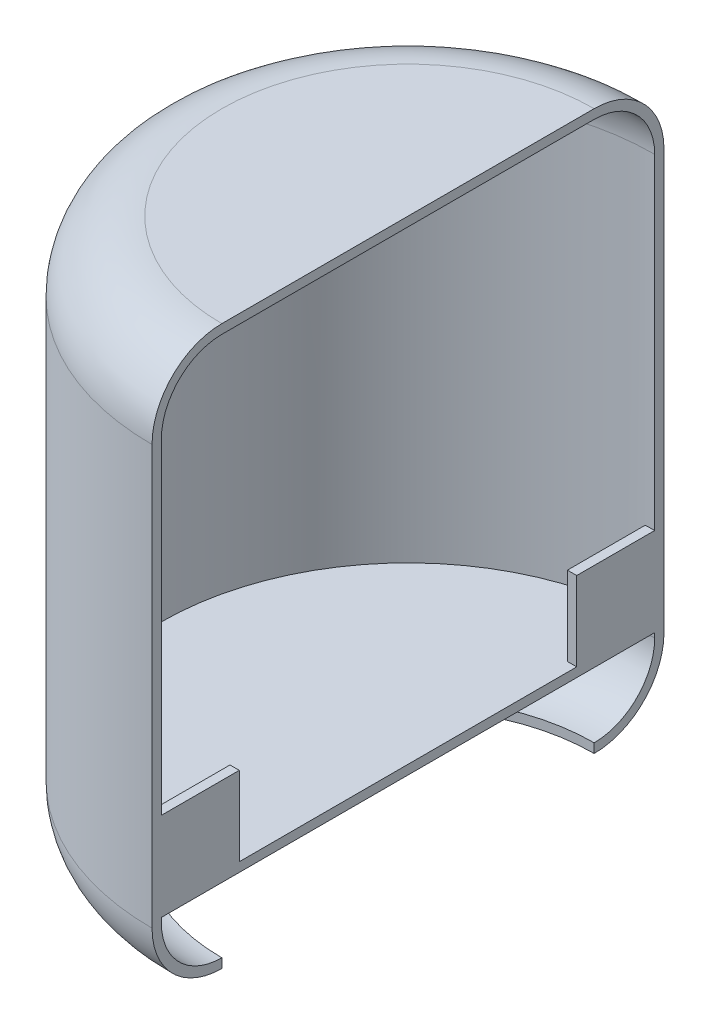
ISO-10303-21;
HEADER;
FILE_DESCRIPTION(('STEP AP214'),'2;1');
FILE_NAME('part.step','',(''),(''),'','','');
FILE_SCHEMA(('AUTOMOTIVE_DESIGN { 1 0 10303 214 1 1 1 1 }'));
ENDSEC;
DATA;
#1=APPLICATION_CONTEXT('core data for automotive mechanical design processes');
#2=APPLICATION_PROTOCOL_DEFINITION('international standard','automotive_design',2000,#1);
#3=PRODUCT_CONTEXT('',#1,'mechanical');
#4=PRODUCT('Part','Part','',(#3));
#5=PRODUCT_RELATED_PRODUCT_CATEGORY('part','',(#4));
#6=PRODUCT_DEFINITION_FORMATION('','',#4);
#7=PRODUCT_DEFINITION_CONTEXT('part definition',#1,'design');
#8=PRODUCT_DEFINITION('design','',#6,#7);
#9=PRODUCT_DEFINITION_SHAPE('','',#8);
#10=(LENGTH_UNIT() NAMED_UNIT(*) SI_UNIT(.MILLI.,.METRE.));
#11=(NAMED_UNIT(*) PLANE_ANGLE_UNIT() SI_UNIT($,.RADIAN.));
#12=(NAMED_UNIT(*) SI_UNIT($,.STERADIAN.) SOLID_ANGLE_UNIT());
#13=UNCERTAINTY_MEASURE_WITH_UNIT(LENGTH_MEASURE(1.E-05),#10,'distance_accuracy_value','');
#14=(GEOMETRIC_REPRESENTATION_CONTEXT(3) GLOBAL_UNCERTAINTY_ASSIGNED_CONTEXT((#13)) GLOBAL_UNIT_ASSIGNED_CONTEXT((#10,
#11,#12)) REPRESENTATION_CONTEXT('',''));
#15=CARTESIAN_POINT('',(0.,0.,0.));
#16=DIRECTION('',(0.,0.,1.));
#17=DIRECTION('',(1.,0.,0.));
#18=AXIS2_PLACEMENT_3D('',#15,#16,#17);
#19=CARTESIAN_POINT('',(-0.00199999999983547,-840.,-1060.));
#20=DIRECTION('',(0.,1.,0.));
#21=DIRECTION('',(0.,0.,1.));
#22=AXIS2_PLACEMENT_3D('',#19,#20,#21);
#23=PLANE('',#22);
#24=DIRECTION('',(0.,0.,1.));
#25=VECTOR('',#24,1.);
#26=CARTESIAN_POINT('',(1100.,-840.,-1060.));
#27=LINE('',#26,#25);
#28=CARTESIAN_POINT('',(1100.,-840.,-724.999999999999));
#29=VERTEX_POINT('',#28);
#30=CARTESIAN_POINT('',(1100.,-840.,725.000000000001));
#31=VERTEX_POINT('',#30);
#32=EDGE_CURVE('E271',#29,#31,#27,.T.);
#33=ORIENTED_EDGE('',*,*,#32,.F.);
#34=DIRECTION('',(1.,0.,0.));
#35=VECTOR('',#34,1.);
#36=CARTESIAN_POINT('',(7415.78,-840.,-725.));
#37=LINE('',#36,#35);
#38=CARTESIAN_POINT('',(1060.,-840.,-724.999999999999));
#39=VERTEX_POINT('',#38);
#40=EDGE_CURVE('E166',#39,#29,#37,.T.);
#41=ORIENTED_EDGE('',*,*,#40,.F.);
#42=DIRECTION('',(0.,0.,1.));
#43=VECTOR('',#42,1.);
#44=CARTESIAN_POINT('',(1060.,-840.,-724.999999999999));
#45=LINE('',#44,#43);
#46=CARTESIAN_POINT('',(1060.,-840.,-1059.24501414923));
#47=VERTEX_POINT('',#46);
#48=EDGE_CURVE('E160',#47,#39,#45,.T.);
#49=ORIENTED_EDGE('',*,*,#48,.F.);
#50=CARTESIAN_POINT('',(1100.,-840.,0.));
#51=DIRECTION('',(0.,1.,0.));
#52=DIRECTION('',(0.,0.,1.));
#53=AXIS2_PLACEMENT_3D('',#50,#51,#52);
#54=CIRCLE('',#53,1060.);
#55=CARTESIAN_POINT('',(1060.,-840.,1059.24501414923));
#56=VERTEX_POINT('',#55);
#57=EDGE_CURVE('E210',#47,#56,#54,.T.);
#58=ORIENTED_EDGE('',*,*,#57,.T.);
#59=DIRECTION('',(0.,0.,1.));
#60=VECTOR('',#59,1.);
#61=CARTESIAN_POINT('',(1060.,-840.,725.000000000001));
#62=LINE('',#61,#60);
#63=CARTESIAN_POINT('',(1060.,-840.,725.000000000001));
#64=VERTEX_POINT('',#63);
#65=EDGE_CURVE('E196',#64,#56,#62,.T.);
#66=ORIENTED_EDGE('',*,*,#65,.F.);
#67=DIRECTION('',(-1.,0.,0.));
#68=VECTOR('',#67,1.);
#69=CARTESIAN_POINT('',(7415.78,-840.,725.));
#70=LINE('',#69,#68);
#71=EDGE_CURVE('E194',#31,#64,#70,.T.);
#72=ORIENTED_EDGE('',*,*,#71,.F.);
#73=EDGE_LOOP('',(#33,#41,#49,#58,#66,#72));
#74=FACE_BOUND('',#73,.T.);
#75=ADVANCED_FACE('F39',(#74),#23,.T.);
#76=CARTESIAN_POINT('',(1060.,-539.99,-724.999999999999));
#77=DIRECTION('',(1.,0.,0.));
#78=DIRECTION('',(0.,0.,-1.));
#79=AXIS2_PLACEMENT_3D('',#76,#77,#78);
#80=PLANE('',#79);
#81=ORIENTED_EDGE('',*,*,#48,.T.);
#82=DIRECTION('',(0.,-1.,0.));
#83=VECTOR('',#82,1.);
#84=CARTESIAN_POINT('',(1060.,-539.99,-724.999999999999));
#85=LINE('',#84,#83);
#86=CARTESIAN_POINT('',(1060.,-499.99,-724.999999999999));
#87=VERTEX_POINT('',#86);
#88=EDGE_CURVE('E155',#87,#39,#85,.T.);
#89=ORIENTED_EDGE('',*,*,#88,.F.);
#90=DIRECTION('',(0.,0.,1.));
#91=VECTOR('',#90,1.);
#92=CARTESIAN_POINT('',(1060.,-499.99,-724.999999999999));
#93=LINE('',#92,#91);
#94=CARTESIAN_POINT('',(1060.,-499.99,-1059.24501414923));
#95=VERTEX_POINT('',#94);
#96=EDGE_CURVE('E158',#95,#87,#93,.T.);
#97=ORIENTED_EDGE('',*,*,#96,.F.);
#98=DIRECTION('',(0.,-1.,0.));
#99=VECTOR('',#98,1.);
#100=CARTESIAN_POINT('',(1060.,-539.99,-1059.24501414923));
#101=LINE('',#100,#99);
#102=EDGE_CURVE('E165',#95,#47,#101,.T.);
#103=ORIENTED_EDGE('',*,*,#102,.T.);
#104=EDGE_LOOP('',(#81,#89,#97,#103));
#105=FACE_BOUND('',#104,.T.);
#106=ADVANCED_FACE('F157',(#105),#80,.F.);
#107=CARTESIAN_POINT('',(1100.,-1200.,0.));
#108=DIRECTION('',(0.,1.,0.));
#109=DIRECTION('',(0.,0.,1.));
#110=AXIS2_PLACEMENT_3D('',#107,#108,#109);
#111=CYLINDRICAL_SURFACE('',#110,1060.);
#112=ORIENTED_EDGE('',*,*,#102,.F.);
#113=CARTESIAN_POINT('',(1100.,-499.99,0.));
#114=DIRECTION('',(0.,-1.,0.));
#115=DIRECTION('',(0.,0.,-1.));
#116=AXIS2_PLACEMENT_3D('',#113,#114,#115);
#117=CIRCLE('',#116,1060.);
#118=CARTESIAN_POINT('',(1100.,-499.99,-1060.));
#119=VERTEX_POINT('',#118);
#120=EDGE_CURVE('E174',#119,#95,#117,.F.);
#121=ORIENTED_EDGE('',*,*,#120,.F.);
#122=DIRECTION('',(0.,-1.,0.));
#123=VECTOR('',#122,1.);
#124=CARTESIAN_POINT('',(1100.,1200.,-1060.));
#125=LINE('',#124,#123);
#126=CARTESIAN_POINT('',(1100.,900.,-1060.));
#127=VERTEX_POINT('',#126);
#128=EDGE_CURVE('E224',#119,#127,#125,.F.);
#129=ORIENTED_EDGE('',*,*,#128,.T.);
#130=CARTESIAN_POINT('',(1100.,900.,0.));
#131=DIRECTION('',(0.,1.,0.));
#132=DIRECTION('',(0.,0.,1.));
#133=AXIS2_PLACEMENT_3D('',#130,#131,#132);
#134=CIRCLE('',#133,1060.);
#135=CARTESIAN_POINT('',(1100.,900.,1060.));
#136=VERTEX_POINT('',#135);
#137=EDGE_CURVE('E223',#136,#127,#134,.F.);
#138=ORIENTED_EDGE('',*,*,#137,.F.);
#139=DIRECTION('',(0.,1.,0.));
#140=VECTOR('',#139,1.);
#141=CARTESIAN_POINT('',(1100.,-1200.,1060.));
#142=LINE('',#141,#140);
#143=CARTESIAN_POINT('',(1100.,-499.99,1060.));
#144=VERTEX_POINT('',#143);
#145=EDGE_CURVE('E48',#144,#136,#142,.T.);
#146=ORIENTED_EDGE('',*,*,#145,.F.);
#147=CARTESIAN_POINT('',(1100.,-499.99,0.));
#148=DIRECTION('',(0.,1.,0.));
#149=DIRECTION('',(0.,0.,1.));
#150=AXIS2_PLACEMENT_3D('',#147,#148,#149);
#151=CIRCLE('',#150,1060.);
#152=CARTESIAN_POINT('',(1060.,-499.99,1059.24501414923));
#153=VERTEX_POINT('',#152);
#154=EDGE_CURVE('E188',#144,#153,#151,.F.);
#155=ORIENTED_EDGE('',*,*,#154,.T.);
#156=DIRECTION('',(0.,-1.,0.));
#157=VECTOR('',#156,1.);
#158=CARTESIAN_POINT('',(1060.,-539.99,1059.24501414923));
#159=LINE('',#158,#157);
#160=EDGE_CURVE('E199',#153,#56,#159,.T.);
#161=ORIENTED_EDGE('',*,*,#160,.T.);
#162=ORIENTED_EDGE('',*,*,#57,.F.);
#163=EDGE_LOOP('',(#112,#121,#129,#138,#146,#155,#161,#162));
#164=FACE_BOUND('',#163,.T.);
#165=ADVANCED_FACE('F290',(#164),#111,.F.);
#166=CARTESIAN_POINT('',(7415.78,-539.99,-725.));
#167=DIRECTION('',(0.,0.,-1.));
#168=DIRECTION('',(-1.,0.,0.));
#169=AXIS2_PLACEMENT_3D('',#166,#167,#168);
#170=PLANE('',#169);
#171=ORIENTED_EDGE('',*,*,#40,.T.);
#172=DIRECTION('',(0.,1.,0.));
#173=VECTOR('',#172,1.);
#174=CARTESIAN_POINT('',(1100.,-539.989999999999,-724.999999999999));
#175=LINE('',#174,#173);
#176=CARTESIAN_POINT('',(1100.,-499.99,-724.999999999999));
#177=VERTEX_POINT('',#176);
#178=EDGE_CURVE('E178',#29,#177,#175,.T.);
#179=ORIENTED_EDGE('',*,*,#178,.T.);
#180=DIRECTION('',(1.,0.,0.));
#181=VECTOR('',#180,1.);
#182=CARTESIAN_POINT('',(1060.,-499.99,-724.999999999999));
#183=LINE('',#182,#181);
#184=EDGE_CURVE('E172',#87,#177,#183,.T.);
#185=ORIENTED_EDGE('',*,*,#184,.F.);
#186=ORIENTED_EDGE('',*,*,#88,.T.);
#187=EDGE_LOOP('',(#171,#179,#185,#186));
#188=FACE_BOUND('',#187,.T.);
#189=ADVANCED_FACE('F176',(#188),#170,.F.);
#190=CARTESIAN_POINT('',(0.,-499.99,-1.76863248850011E-13));
#191=DIRECTION('',(0.,-1.,0.));
#192=DIRECTION('',(0.,0.,-1.));
#193=AXIS2_PLACEMENT_3D('',#190,#191,#192);
#194=PLANE('',#193);
#195=ORIENTED_EDGE('',*,*,#184,.T.);
#196=DIRECTION('',(0.,0.,-1.));
#197=VECTOR('',#196,1.);
#198=CARTESIAN_POINT('',(1100.,-499.99,-1.76863248850011E-13));
#199=LINE('',#198,#197);
#200=EDGE_CURVE('E262',#177,#119,#199,.T.);
#201=ORIENTED_EDGE('',*,*,#200,.T.);
#202=ORIENTED_EDGE('',*,*,#120,.T.);
#203=ORIENTED_EDGE('',*,*,#96,.T.);
#204=EDGE_LOOP('',(#195,#201,#202,#203));
#205=FACE_BOUND('',#204,.T.);
#206=ADVANCED_FACE('F171',(#205),#194,.F.);
#207=CARTESIAN_POINT('',(1060.,-539.99,725.000000000001));
#208=DIRECTION('',(1.,0.,0.));
#209=DIRECTION('',(0.,0.,-1.));
#210=AXIS2_PLACEMENT_3D('',#207,#208,#209);
#211=PLANE('',#210);
#212=ORIENTED_EDGE('',*,*,#65,.T.);
#213=ORIENTED_EDGE('',*,*,#160,.F.);
#214=DIRECTION('',(0.,0.,1.));
#215=VECTOR('',#214,1.);
#216=CARTESIAN_POINT('',(1060.,-499.99,725.000000000001));
#217=LINE('',#216,#215);
#218=CARTESIAN_POINT('',(1060.,-499.99,725.000000000001));
#219=VERTEX_POINT('',#218);
#220=EDGE_CURVE('E181',#219,#153,#217,.T.);
#221=ORIENTED_EDGE('',*,*,#220,.F.);
#222=DIRECTION('',(0.,-1.,0.));
#223=VECTOR('',#222,1.);
#224=CARTESIAN_POINT('',(1060.,-539.99,725.000000000001));
#225=LINE('',#224,#223);
#226=EDGE_CURVE('E202',#219,#64,#225,.T.);
#227=ORIENTED_EDGE('',*,*,#226,.T.);
#228=EDGE_LOOP('',(#212,#213,#221,#227));
#229=FACE_BOUND('',#228,.T.);
#230=ADVANCED_FACE('F302',(#229),#211,.F.);
#231=CARTESIAN_POINT('',(7415.78,-539.99,725.));
#232=DIRECTION('',(0.,0.,1.));
#233=DIRECTION('',(1.,0.,0.));
#234=AXIS2_PLACEMENT_3D('',#231,#232,#233);
#235=PLANE('',#234);
#236=DIRECTION('',(-1.,0.,0.));
#237=VECTOR('',#236,1.);
#238=CARTESIAN_POINT('',(1060.,-499.99,725.000000000001));
#239=LINE('',#238,#237);
#240=CARTESIAN_POINT('',(1100.,-499.99,725.000000000001));
#241=VERTEX_POINT('',#240);
#242=EDGE_CURVE('E186',#241,#219,#239,.T.);
#243=ORIENTED_EDGE('',*,*,#242,.F.);
#244=DIRECTION('',(0.,-1.,0.));
#245=VECTOR('',#244,1.);
#246=CARTESIAN_POINT('',(1100.,-539.989999999999,725.000000000001));
#247=LINE('',#246,#245);
#248=EDGE_CURVE('E270',#241,#31,#247,.T.);
#249=ORIENTED_EDGE('',*,*,#248,.T.);
#250=ORIENTED_EDGE('',*,*,#71,.T.);
#251=ORIENTED_EDGE('',*,*,#226,.F.);
#252=EDGE_LOOP('',(#243,#249,#250,#251));
#253=FACE_BOUND('',#252,.T.);
#254=ADVANCED_FACE('F299',(#253),#235,.F.);
#255=CARTESIAN_POINT('',(0.,-499.99,-1.76863248850011E-13));
#256=DIRECTION('',(0.,1.,0.));
#257=DIRECTION('',(0.,0.,1.));
#258=AXIS2_PLACEMENT_3D('',#255,#256,#257);
#259=PLANE('',#258);
#260=DIRECTION('',(0.,0.,1.));
#261=VECTOR('',#260,1.);
#262=CARTESIAN_POINT('',(1100.,-499.99,-1.76863248850011E-13));
#263=LINE('',#262,#261);
#264=EDGE_CURVE('E250',#241,#144,#263,.T.);
#265=ORIENTED_EDGE('',*,*,#264,.F.);
#266=ORIENTED_EDGE('',*,*,#242,.T.);
#267=ORIENTED_EDGE('',*,*,#220,.T.);
#268=ORIENTED_EDGE('',*,*,#154,.F.);
#269=EDGE_LOOP('',(#265,#266,#267,#268));
#270=FACE_BOUND('',#269,.T.);
#271=ADVANCED_FACE('F305',(#270),#259,.T.);
#272=CARTESIAN_POINT('',(9000.,1160.,1100.));
#273=DIRECTION('',(0.,-1.,0.));
#274=DIRECTION('',(0.,0.,-1.));
#275=AXIS2_PLACEMENT_3D('',#272,#273,#274);
#276=PLANE('',#275);
#277=DIRECTION('',(0.,0.,-1.));
#278=VECTOR('',#277,1.);
#279=CARTESIAN_POINT('',(1100.,1160.,1100.));
#280=LINE('',#279,#278);
#281=CARTESIAN_POINT('',(1100.,1160.,800.));
#282=VERTEX_POINT('',#281);
#283=CARTESIAN_POINT('',(1100.,1160.,-800.));
#284=VERTEX_POINT('',#283);
#285=EDGE_CURVE('E274',#282,#284,#280,.T.);
#286=ORIENTED_EDGE('',*,*,#285,.F.);
#287=CARTESIAN_POINT('',(1100.,1160.,0.));
#288=DIRECTION('',(0.,-1.,0.));
#289=DIRECTION('',(0.,0.,-1.));
#290=AXIS2_PLACEMENT_3D('',#287,#288,#289);
#291=CIRCLE('',#290,800.);
#292=EDGE_CURVE('E227',#284,#282,#291,.F.);
#293=ORIENTED_EDGE('',*,*,#292,.F.);
#294=EDGE_LOOP('',(#286,#293));
#295=FACE_BOUND('',#294,.T.);
#296=ADVANCED_FACE('F285',(#295),#276,.T.);
#297=CARTESIAN_POINT('',(1100.,900.,0.));
#298=DIRECTION('',(0.,-1.,0.));
#299=DIRECTION('',(0.,0.,-1.));
#300=AXIS2_PLACEMENT_3D('',#297,#298,#299);
#301=TOROIDAL_SURFACE('',#300,800.,260.);
#302=CARTESIAN_POINT('',(1100.,900.,-800.));
#303=DIRECTION('',(-1.,0.,0.));
#304=DIRECTION('',(0.,0.,1.));
#305=AXIS2_PLACEMENT_3D('',#302,#303,#304);
#306=CIRCLE('',#305,260.);
#307=EDGE_CURVE('E11',#284,#127,#306,.T.);
#308=ORIENTED_EDGE('',*,*,#307,.F.);
#309=ORIENTED_EDGE('',*,*,#292,.T.);
#310=CARTESIAN_POINT('',(1100.,900.,800.));
#311=DIRECTION('',(-1.,0.,0.));
#312=DIRECTION('',(0.,0.,1.));
#313=AXIS2_PLACEMENT_3D('',#310,#311,#312);
#314=CIRCLE('',#313,260.);
#315=EDGE_CURVE('E212',#282,#136,#314,.F.);
#316=ORIENTED_EDGE('',*,*,#315,.T.);
#317=ORIENTED_EDGE('',*,*,#137,.T.);
#318=EDGE_LOOP('',(#308,#309,#316,#317));
#319=FACE_BOUND('',#318,.T.);
#320=ADVANCED_FACE('F287',(#319),#301,.F.);
#321=CARTESIAN_POINT('',(9000.,1200.,1100.));
#322=DIRECTION('',(0.,-1.,0.));
#323=DIRECTION('',(0.,0.,-1.));
#324=AXIS2_PLACEMENT_3D('',#321,#322,#323);
#325=PLANE('',#324);
#326=CARTESIAN_POINT('',(1100.,1200.,0.));
#327=DIRECTION('',(0.,-1.,0.));
#328=DIRECTION('',(0.,0.,-1.));
#329=AXIS2_PLACEMENT_3D('',#326,#327,#328);
#330=CIRCLE('',#329,800.);
#331=CARTESIAN_POINT('',(1100.,1200.,-800.));
#332=VERTEX_POINT('',#331);
#333=CARTESIAN_POINT('',(1100.,1200.,800.));
#334=VERTEX_POINT('',#333);
#335=EDGE_CURVE('E259',#332,#334,#330,.F.);
#336=ORIENTED_EDGE('',*,*,#335,.T.);
#337=DIRECTION('',(0.,0.,-1.));
#338=VECTOR('',#337,1.);
#339=CARTESIAN_POINT('',(1100.,1200.,1100.));
#340=LINE('',#339,#338);
#341=EDGE_CURVE('E43',#334,#332,#340,.T.);
#342=ORIENTED_EDGE('',*,*,#341,.T.);
#343=EDGE_LOOP('',(#336,#342));
#344=FACE_BOUND('',#343,.T.);
#345=ADVANCED_FACE('F317',(#344),#325,.F.);
#346=CARTESIAN_POINT('',(1100.,-1200.,0.));
#347=DIRECTION('',(0.,1.,0.));
#348=DIRECTION('',(0.,0.,1.));
#349=AXIS2_PLACEMENT_3D('',#346,#347,#348);
#350=CYLINDRICAL_SURFACE('',#349,1100.);
#351=DIRECTION('',(0.,1.,0.));
#352=VECTOR('',#351,1.);
#353=CARTESIAN_POINT('',(1100.,-1200.,-1100.));
#354=LINE('',#353,#352);
#355=CARTESIAN_POINT('',(1100.,-900.,-1100.));
#356=VERTEX_POINT('',#355);
#357=CARTESIAN_POINT('',(1100.,900.,-1100.));
#358=VERTEX_POINT('',#357);
#359=EDGE_CURVE('E246',#356,#358,#354,.T.);
#360=ORIENTED_EDGE('',*,*,#359,.F.);
#361=CARTESIAN_POINT('',(1100.,-900.,0.));
#362=DIRECTION('',(0.,1.,0.));
#363=DIRECTION('',(0.,0.,1.));
#364=AXIS2_PLACEMENT_3D('',#361,#362,#363);
#365=CIRCLE('',#364,1100.);
#366=CARTESIAN_POINT('',(1100.,-900.,1100.));
#367=VERTEX_POINT('',#366);
#368=EDGE_CURVE('E256',#356,#367,#365,.T.);
#369=ORIENTED_EDGE('',*,*,#368,.T.);
#370=DIRECTION('',(0.,1.,0.));
#371=VECTOR('',#370,1.);
#372=CARTESIAN_POINT('',(1100.,-1200.,1100.));
#373=LINE('',#372,#371);
#374=CARTESIAN_POINT('',(1100.,900.,1100.));
#375=VERTEX_POINT('',#374);
#376=EDGE_CURVE('E242',#367,#375,#373,.T.);
#377=ORIENTED_EDGE('',*,*,#376,.T.);
#378=CARTESIAN_POINT('',(1100.,900.,0.));
#379=DIRECTION('',(0.,-1.,0.));
#380=DIRECTION('',(0.,0.,-1.));
#381=AXIS2_PLACEMENT_3D('',#378,#379,#380);
#382=CIRCLE('',#381,1100.);
#383=EDGE_CURVE('E253',#375,#358,#382,.T.);
#384=ORIENTED_EDGE('',*,*,#383,.T.);
#385=EDGE_LOOP('',(#360,#369,#377,#384));
#386=FACE_BOUND('',#385,.T.);
#387=ADVANCED_FACE('F322',(#386),#350,.T.);
#388=CARTESIAN_POINT('',(1100.,-900.,-1060.));
#389=VERTEX_POINT('',#388);
#390=CARTESIAN_POINT('',(1100.,-880.,-1060.));
#391=VERTEX_POINT('',#390);
#392=EDGE_CURVE('E221',#389,#391,#125,.F.);
#393=ORIENTED_EDGE('',*,*,#392,.T.);
#394=CARTESIAN_POINT('',(1100.,-880.,0.));
#395=DIRECTION('',(0.,-1.,0.));
#396=DIRECTION('',(0.,0.,-1.));
#397=AXIS2_PLACEMENT_3D('',#394,#395,#396);
#398=CIRCLE('',#397,1060.);
#399=CARTESIAN_POINT('',(1100.,-880.,1060.));
#400=VERTEX_POINT('',#399);
#401=EDGE_CURVE('E208',#400,#391,#398,.T.);
#402=ORIENTED_EDGE('',*,*,#401,.F.);
#403=CARTESIAN_POINT('',(1100.,-900.,1060.));
#404=VERTEX_POINT('',#403);
#405=EDGE_CURVE('E56',#404,#400,#142,.T.);
#406=ORIENTED_EDGE('',*,*,#405,.F.);
#407=CARTESIAN_POINT('',(1100.,-900.,0.));
#408=DIRECTION('',(0.,1.,0.));
#409=DIRECTION('',(0.,0.,1.));
#410=AXIS2_PLACEMENT_3D('',#407,#408,#409);
#411=CIRCLE('',#410,1060.);
#412=EDGE_CURVE('E225',#389,#404,#411,.T.);
#413=ORIENTED_EDGE('',*,*,#412,.F.);
#414=EDGE_LOOP('',(#393,#402,#406,#413));
#415=FACE_BOUND('',#414,.T.);
#416=ADVANCED_FACE('F330',(#415),#111,.F.);
#417=CARTESIAN_POINT('',(1100.,-900.,0.));
#418=DIRECTION('',(0.,1.,0.));
#419=DIRECTION('',(0.,0.,1.));
#420=AXIS2_PLACEMENT_3D('',#417,#418,#419);
#421=TOROIDAL_SURFACE('',#420,800.,260.);
#422=CARTESIAN_POINT('',(1100.,-900.,-800.));
#423=DIRECTION('',(1.,0.,0.));
#424=DIRECTION('',(0.,0.,-1.));
#425=AXIS2_PLACEMENT_3D('',#422,#423,#424);
#426=CIRCLE('',#425,260.);
#427=CARTESIAN_POINT('',(1099.99999999999,-1160.,-800.));
#428=VERTEX_POINT('',#427);
#429=EDGE_CURVE('E232',#389,#428,#426,.F.);
#430=ORIENTED_EDGE('',*,*,#429,.F.);
#431=ORIENTED_EDGE('',*,*,#412,.T.);
#432=CARTESIAN_POINT('',(1100.,-900.,800.));
#433=DIRECTION('',(-1.,0.,0.));
#434=DIRECTION('',(0.,0.,1.));
#435=AXIS2_PLACEMENT_3D('',#432,#433,#434);
#436=CIRCLE('',#435,260.);
#437=CARTESIAN_POINT('',(1100.,-1160.,800.));
#438=VERTEX_POINT('',#437);
#439=EDGE_CURVE('E234',#404,#438,#436,.F.);
#440=ORIENTED_EDGE('',*,*,#439,.T.);
#441=CARTESIAN_POINT('',(1100.,-1160.,0.));
#442=DIRECTION('',(0.,1.,0.));
#443=DIRECTION('',(0.,0.,1.));
#444=AXIS2_PLACEMENT_3D('',#441,#442,#443);
#445=CIRCLE('',#444,800.);
#446=EDGE_CURVE('E217',#438,#428,#445,.F.);
#447=ORIENTED_EDGE('',*,*,#446,.T.);
#448=EDGE_LOOP('',(#430,#431,#440,#447));
#449=FACE_BOUND('',#448,.T.);
#450=ADVANCED_FACE('F327',(#449),#421,.F.);
#451=CARTESIAN_POINT('',(1100.,-900.,0.));
#452=DIRECTION('',(0.,1.,0.));
#453=DIRECTION('',(0.,0.,1.));
#454=AXIS2_PLACEMENT_3D('',#451,#452,#453);
#455=TOROIDAL_SURFACE('',#454,800.,300.);
#456=CARTESIAN_POINT('',(1100.,-900.,-800.));
#457=DIRECTION('',(-1.,0.,0.));
#458=DIRECTION('',(0.,0.,1.));
#459=AXIS2_PLACEMENT_3D('',#456,#457,#458);
#460=CIRCLE('',#459,300.);
#461=CARTESIAN_POINT('',(1100.,-1200.,-800.));
#462=VERTEX_POINT('',#461);
#463=EDGE_CURVE('E245',#356,#462,#460,.T.);
#464=ORIENTED_EDGE('',*,*,#463,.T.);
#465=CARTESIAN_POINT('',(1100.,-1200.,0.));
#466=DIRECTION('',(0.,1.,0.));
#467=DIRECTION('',(0.,0.,1.));
#468=AXIS2_PLACEMENT_3D('',#465,#466,#467);
#469=CIRCLE('',#468,800.);
#470=CARTESIAN_POINT('',(1100.,-1200.,800.));
#471=VERTEX_POINT('',#470);
#472=EDGE_CURVE('E244',#471,#462,#469,.F.);
#473=ORIENTED_EDGE('',*,*,#472,.F.);
#474=CARTESIAN_POINT('',(1100.,-900.,800.));
#475=DIRECTION('',(-1.,0.,0.));
#476=DIRECTION('',(0.,0.,1.));
#477=AXIS2_PLACEMENT_3D('',#474,#475,#476);
#478=CIRCLE('',#477,300.);
#479=EDGE_CURVE('E205',#367,#471,#478,.F.);
#480=ORIENTED_EDGE('',*,*,#479,.F.);
#481=ORIENTED_EDGE('',*,*,#368,.F.);
#482=EDGE_LOOP('',(#464,#473,#480,#481));
#483=FACE_BOUND('',#482,.T.);
#484=ADVANCED_FACE('F41',(#483),#455,.T.);
#485=CARTESIAN_POINT('',(1100.,-1200.,0.));
#486=DIRECTION('',(0.,1.,0.));
#487=DIRECTION('',(0.,0.,1.));
#488=AXIS2_PLACEMENT_3D('',#485,#486,#487);
#489=CYLINDRICAL_SURFACE('',#488,800.);
#490=ORIENTED_EDGE('',*,*,#472,.T.);
#491=DIRECTION('',(0.,-1.,0.));
#492=VECTOR('',#491,1.);
#493=CARTESIAN_POINT('',(1100.,-1200.,-800.));
#494=LINE('',#493,#492);
#495=EDGE_CURVE('E216',#428,#462,#494,.T.);
#496=ORIENTED_EDGE('',*,*,#495,.F.);
#497=ORIENTED_EDGE('',*,*,#446,.F.);
#498=DIRECTION('',(0.,-1.,0.));
#499=VECTOR('',#498,1.);
#500=CARTESIAN_POINT('',(1100.,-1200.,800.));
#501=LINE('',#500,#499);
#502=EDGE_CURVE('E213',#438,#471,#501,.T.);
#503=ORIENTED_EDGE('',*,*,#502,.T.);
#504=EDGE_LOOP('',(#490,#496,#497,#503));
#505=FACE_BOUND('',#504,.T.);
#506=ADVANCED_FACE('F342',(#505),#489,.F.);
#507=CARTESIAN_POINT('',(-0.00199999999983547,-880.,-1060.));
#508=DIRECTION('',(0.,-1.,0.));
#509=DIRECTION('',(0.,0.,-1.));
#510=AXIS2_PLACEMENT_3D('',#507,#508,#509);
#511=PLANE('',#510);
#512=DIRECTION('',(0.,0.,-1.));
#513=VECTOR('',#512,1.);
#514=CARTESIAN_POINT('',(1100.,-880.,-1060.00000000001));
#515=LINE('',#514,#513);
#516=EDGE_CURVE('E63',#400,#391,#515,.T.);
#517=ORIENTED_EDGE('',*,*,#516,.F.);
#518=ORIENTED_EDGE('',*,*,#401,.T.);
#519=EDGE_LOOP('',(#517,#518));
#520=FACE_BOUND('',#519,.T.);
#521=ADVANCED_FACE('F334',(#520),#511,.T.);
#522=CARTESIAN_POINT('',(1100.,900.,0.));
#523=DIRECTION('',(0.,-1.,0.));
#524=DIRECTION('',(0.,0.,-1.));
#525=AXIS2_PLACEMENT_3D('',#522,#523,#524);
#526=TOROIDAL_SURFACE('',#525,800.,300.);
#527=CARTESIAN_POINT('',(1100.,900.,-800.));
#528=DIRECTION('',(-1.,0.,0.));
#529=DIRECTION('',(0.,0.,1.));
#530=AXIS2_PLACEMENT_3D('',#527,#528,#529);
#531=CIRCLE('',#530,300.);
#532=EDGE_CURVE('E220',#332,#358,#531,.T.);
#533=ORIENTED_EDGE('',*,*,#532,.T.);
#534=ORIENTED_EDGE('',*,*,#383,.F.);
#535=CARTESIAN_POINT('',(1100.,900.,800.));
#536=DIRECTION('',(1.,0.,0.));
#537=DIRECTION('',(0.,0.,-1.));
#538=AXIS2_PLACEMENT_3D('',#535,#536,#537);
#539=CIRCLE('',#538,300.);
#540=EDGE_CURVE('E249',#334,#375,#539,.T.);
#541=ORIENTED_EDGE('',*,*,#540,.F.);
#542=ORIENTED_EDGE('',*,*,#335,.F.);
#543=EDGE_LOOP('',(#533,#534,#541,#542));
#544=FACE_BOUND('',#543,.T.);
#545=ADVANCED_FACE('F332',(#544),#526,.T.);
#546=CARTESIAN_POINT('',(1100.,-1200.,-1060.));
#547=DIRECTION('',(-1.,0.,0.));
#548=DIRECTION('',(0.,0.,1.));
#549=AXIS2_PLACEMENT_3D('',#546,#547,#548);
#550=PLANE('',#549);
#551=ORIENTED_EDGE('',*,*,#495,.T.);
#552=ORIENTED_EDGE('',*,*,#463,.F.);
#553=ORIENTED_EDGE('',*,*,#359,.T.);
#554=ORIENTED_EDGE('',*,*,#532,.F.);
#555=ORIENTED_EDGE('',*,*,#341,.F.);
#556=ORIENTED_EDGE('',*,*,#540,.T.);
#557=ORIENTED_EDGE('',*,*,#376,.F.);
#558=ORIENTED_EDGE('',*,*,#479,.T.);
#559=ORIENTED_EDGE('',*,*,#502,.F.);
#560=ORIENTED_EDGE('',*,*,#439,.F.);
#561=ORIENTED_EDGE('',*,*,#405,.T.);
#562=ORIENTED_EDGE('',*,*,#516,.T.);
#563=ORIENTED_EDGE('',*,*,#392,.F.);
#564=ORIENTED_EDGE('',*,*,#429,.T.);
#565=EDGE_LOOP('',(#551,#552,#553,#554,#555,#556,#557,#558,#559,#560,#561,#562,#563,#564));
#566=FACE_BOUND('',#565,.T.);
#567=ORIENTED_EDGE('',*,*,#128,.F.);
#568=ORIENTED_EDGE('',*,*,#200,.F.);
#569=ORIENTED_EDGE('',*,*,#178,.F.);
#570=ORIENTED_EDGE('',*,*,#32,.T.);
#571=ORIENTED_EDGE('',*,*,#248,.F.);
#572=ORIENTED_EDGE('',*,*,#264,.T.);
#573=ORIENTED_EDGE('',*,*,#145,.T.);
#574=ORIENTED_EDGE('',*,*,#315,.F.);
#575=ORIENTED_EDGE('',*,*,#285,.T.);
#576=ORIENTED_EDGE('',*,*,#307,.T.);
#577=EDGE_LOOP('',(#567,#568,#569,#570,#571,#572,#573,#574,#575,#576));
#578=FACE_BOUND('',#577,.T.);
#579=ADVANCED_FACE('F282',(#566,#578),#550,.F.);
#580=CLOSED_SHELL('',(#75,#106,#165,#189,#206,#230,#254,#271,#296,#320,#345,#387,#416,#450,#484,
#506,#521,#545,#579));
#581=MANIFOLD_SOLID_BREP('B2',#580);
#582=ADVANCED_BREP_SHAPE_REPRESENTATION('',(#18,#581),#14);
#583=SHAPE_DEFINITION_REPRESENTATION(#9,#582);
ENDSEC;
END-ISO-10303-21;
